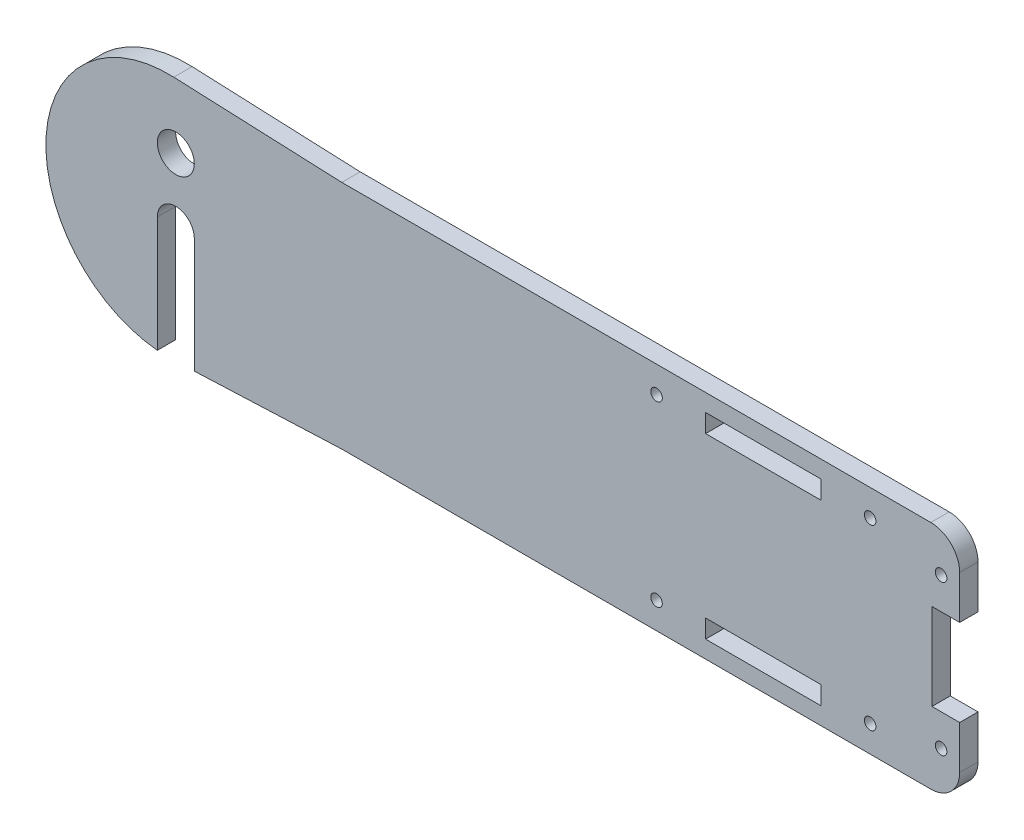
ISO-10303-21;
HEADER;
FILE_DESCRIPTION(('STEP AP214'),'2;1');
FILE_NAME('part.step','',(''),(''),'','','');
FILE_SCHEMA(('AUTOMOTIVE_DESIGN { 1 0 10303 214 1 1 1 1 }'));
ENDSEC;
DATA;
#1=APPLICATION_CONTEXT('core data for automotive mechanical design processes');
#2=APPLICATION_PROTOCOL_DEFINITION('international standard','automotive_design',2000,#1);
#3=PRODUCT_CONTEXT('',#1,'mechanical');
#4=PRODUCT('Part','Part','',(#3));
#5=PRODUCT_RELATED_PRODUCT_CATEGORY('part','',(#4));
#6=PRODUCT_DEFINITION_FORMATION('','',#4);
#7=PRODUCT_DEFINITION_CONTEXT('part definition',#1,'design');
#8=PRODUCT_DEFINITION('design','',#6,#7);
#9=PRODUCT_DEFINITION_SHAPE('','',#8);
#10=(LENGTH_UNIT() NAMED_UNIT(*) SI_UNIT(.MILLI.,.METRE.));
#11=(NAMED_UNIT(*) PLANE_ANGLE_UNIT() SI_UNIT($,.RADIAN.));
#12=(NAMED_UNIT(*) SI_UNIT($,.STERADIAN.) SOLID_ANGLE_UNIT());
#13=UNCERTAINTY_MEASURE_WITH_UNIT(LENGTH_MEASURE(1.E-05),#10,'distance_accuracy_value','');
#14=(GEOMETRIC_REPRESENTATION_CONTEXT(3) GLOBAL_UNCERTAINTY_ASSIGNED_CONTEXT((#13)) GLOBAL_UNIT_ASSIGNED_CONTEXT((#10,
#11,#12)) REPRESENTATION_CONTEXT('',''));
#15=CARTESIAN_POINT('',(0.,0.,0.));
#16=DIRECTION('',(0.,0.,1.));
#17=DIRECTION('',(1.,0.,0.));
#18=AXIS2_PLACEMENT_3D('',#15,#16,#17);
#19=CARTESIAN_POINT('',(-112.,0.,-3.175));
#20=DIRECTION('',(0.,0.,1.));
#21=DIRECTION('',(1.,0.,0.));
#22=AXIS2_PLACEMENT_3D('',#19,#20,#21);
#23=PLANE('',#22);
#24=CARTESIAN_POINT('',(-27.5,-15.4125,-3.175));
#25=DIRECTION('',(0.,0.,-1.));
#26=DIRECTION('',(1.,0.,0.));
#27=AXIS2_PLACEMENT_3D('',#24,#25,#26);
#28=CIRCLE('',#27,1.);
#29=CARTESIAN_POINT('',(-26.5,-15.4125,-3.175));
#30=VERTEX_POINT('',#29);
#31=EDGE_CURVE('E284',#30,#30,#28,.T.);
#32=ORIENTED_EDGE('',*,*,#31,.F.);
#33=EDGE_LOOP('',(#32));
#34=FACE_BOUND('',#33,.T.);
#35=CARTESIAN_POINT('',(9.5,-15.4125,-3.175));
#36=DIRECTION('',(0.,0.,-1.));
#37=DIRECTION('',(1.,0.,0.));
#38=AXIS2_PLACEMENT_3D('',#35,#36,#37);
#39=CIRCLE('',#38,1.);
#40=CARTESIAN_POINT('',(10.5,-15.4125,-3.175));
#41=VERTEX_POINT('',#40);
#42=EDGE_CURVE('E363',#41,#41,#39,.T.);
#43=ORIENTED_EDGE('',*,*,#42,.F.);
#44=EDGE_LOOP('',(#43));
#45=FACE_BOUND('',#44,.T.);
#46=DIRECTION('',(0.,1.,0.));
#47=VECTOR('',#46,1.);
#48=CARTESIAN_POINT('',(-19.,-17.,-3.175));
#49=LINE('',#48,#47);
#50=CARTESIAN_POINT('',(-19.,-17.,-3.175));
#51=VERTEX_POINT('',#50);
#52=CARTESIAN_POINT('',(-19.,-13.825,-3.175));
#53=VERTEX_POINT('',#52);
#54=EDGE_CURVE('E366',#51,#53,#49,.T.);
#55=ORIENTED_EDGE('',*,*,#54,.F.);
#56=DIRECTION('',(-1.,0.,0.));
#57=VECTOR('',#56,1.);
#58=CARTESIAN_POINT('',(-19.,-17.,-3.175));
#59=LINE('',#58,#57);
#60=CARTESIAN_POINT('',(1.,-17.,-3.175));
#61=VERTEX_POINT('',#60);
#62=EDGE_CURVE('E370',#61,#51,#59,.T.);
#63=ORIENTED_EDGE('',*,*,#62,.F.);
#64=DIRECTION('',(0.,-1.,0.));
#65=VECTOR('',#64,1.);
#66=CARTESIAN_POINT('',(1.,-17.,-3.175));
#67=LINE('',#66,#65);
#68=CARTESIAN_POINT('',(0.999999999999997,-13.825,-3.175));
#69=VERTEX_POINT('',#68);
#70=EDGE_CURVE('E372',#69,#61,#67,.T.);
#71=ORIENTED_EDGE('',*,*,#70,.F.);
#72=DIRECTION('',(1.,0.,0.));
#73=VECTOR('',#72,1.);
#74=CARTESIAN_POINT('',(-19.,-13.825,-3.175));
#75=LINE('',#74,#73);
#76=EDGE_CURVE('E375',#53,#69,#75,.T.);
#77=ORIENTED_EDGE('',*,*,#76,.F.);
#78=EDGE_LOOP('',(#55,#63,#71,#77));
#79=FACE_BOUND('',#78,.T.);
#80=CARTESIAN_POINT('',(-27.5,15.4125,-3.175));
#81=DIRECTION('',(0.,0.,1.));
#82=DIRECTION('',(1.,0.,0.));
#83=AXIS2_PLACEMENT_3D('',#80,#81,#82);
#84=CIRCLE('',#83,1.);
#85=CARTESIAN_POINT('',(-26.5,15.4125,-3.175));
#86=VERTEX_POINT('',#85);
#87=EDGE_CURVE('E274',#86,#86,#84,.T.);
#88=ORIENTED_EDGE('',*,*,#87,.T.);
#89=EDGE_LOOP('',(#88));
#90=FACE_BOUND('',#89,.T.);
#91=CARTESIAN_POINT('',(9.5,15.4125,-3.175));
#92=DIRECTION('',(0.,0.,1.));
#93=DIRECTION('',(1.,0.,0.));
#94=AXIS2_PLACEMENT_3D('',#91,#92,#93);
#95=CIRCLE('',#94,1.);
#96=CARTESIAN_POINT('',(10.5,15.4125,-3.175));
#97=VERTEX_POINT('',#96);
#98=EDGE_CURVE('E387',#97,#97,#95,.T.);
#99=ORIENTED_EDGE('',*,*,#98,.T.);
#100=EDGE_LOOP('',(#99));
#101=FACE_BOUND('',#100,.T.);
#102=DIRECTION('',(-1.,0.,0.));
#103=VECTOR('',#102,1.);
#104=CARTESIAN_POINT('',(-19.,17.,-3.175));
#105=LINE('',#104,#103);
#106=CARTESIAN_POINT('',(1.,17.,-3.175));
#107=VERTEX_POINT('',#106);
#108=CARTESIAN_POINT('',(-19.,17.,-3.175));
#109=VERTEX_POINT('',#108);
#110=EDGE_CURVE('E401',#107,#109,#105,.T.);
#111=ORIENTED_EDGE('',*,*,#110,.T.);
#112=DIRECTION('',(0.,-1.,0.));
#113=VECTOR('',#112,1.);
#114=CARTESIAN_POINT('',(-19.,17.,-3.175));
#115=LINE('',#114,#113);
#116=CARTESIAN_POINT('',(-19.,13.825,-3.175));
#117=VERTEX_POINT('',#116);
#118=EDGE_CURVE('E390',#109,#117,#115,.T.);
#119=ORIENTED_EDGE('',*,*,#118,.T.);
#120=DIRECTION('',(1.,0.,0.));
#121=VECTOR('',#120,1.);
#122=CARTESIAN_POINT('',(-19.,13.825,-3.175));
#123=LINE('',#122,#121);
#124=CARTESIAN_POINT('',(1.,13.825,-3.175));
#125=VERTEX_POINT('',#124);
#126=EDGE_CURVE('E395',#117,#125,#123,.T.);
#127=ORIENTED_EDGE('',*,*,#126,.T.);
#128=DIRECTION('',(0.,1.,0.));
#129=VECTOR('',#128,1.);
#130=CARTESIAN_POINT('',(1.,17.,-3.175));
#131=LINE('',#130,#129);
#132=EDGE_CURVE('E398',#125,#107,#131,.T.);
#133=ORIENTED_EDGE('',*,*,#132,.T.);
#134=EDGE_LOOP('',(#111,#119,#127,#133));
#135=FACE_BOUND('',#134,.T.);
#136=CARTESIAN_POINT('',(-110.75,9.99999999999999,-3.175));
#137=DIRECTION('',(0.,0.,1.));
#138=DIRECTION('',(1.,0.,0.));
#139=AXIS2_PLACEMENT_3D('',#136,#137,#138);
#140=CIRCLE('',#139,3.20000000000001);
#141=CARTESIAN_POINT('',(-107.55,9.99999999999999,-3.175));
#142=VERTEX_POINT('',#141);
#143=EDGE_CURVE('E238',#142,#142,#140,.T.);
#144=ORIENTED_EDGE('',*,*,#143,.T.);
#145=EDGE_LOOP('',(#144));
#146=FACE_BOUND('',#145,.T.);
#147=CARTESIAN_POINT('',(21.7875,13.,-3.175));
#148=DIRECTION('',(0.,0.,1.));
#149=DIRECTION('',(1.,0.,0.));
#150=AXIS2_PLACEMENT_3D('',#147,#148,#149);
#151=CIRCLE('',#150,1.);
#152=CARTESIAN_POINT('',(22.7875,13.,-3.175));
#153=VERTEX_POINT('',#152);
#154=EDGE_CURVE('E441',#153,#153,#151,.T.);
#155=ORIENTED_EDGE('',*,*,#154,.T.);
#156=EDGE_LOOP('',(#155));
#157=FACE_BOUND('',#156,.T.);
#158=CARTESIAN_POINT('',(21.7875,-13.,-3.175));
#159=DIRECTION('',(0.,0.,1.));
#160=DIRECTION('',(1.,0.,0.));
#161=AXIS2_PLACEMENT_3D('',#158,#159,#160);
#162=CIRCLE('',#161,1.);
#163=CARTESIAN_POINT('',(22.7875,-13.,-3.175));
#164=VERTEX_POINT('',#163);
#165=EDGE_CURVE('E444',#164,#164,#162,.T.);
#166=ORIENTED_EDGE('',*,*,#165,.T.);
#167=EDGE_LOOP('',(#166));
#168=FACE_BOUND('',#167,.T.);
#169=DIRECTION('',(0.,-1.,0.));
#170=VECTOR('',#169,1.);
#171=CARTESIAN_POINT('',(-107.55,0.,-3.175));
#172=LINE('',#171,#170);
#173=CARTESIAN_POINT('',(-107.55,-1.16034026191451,-3.17500000000001));
#174=VERTEX_POINT('',#173);
#175=CARTESIAN_POINT('',(-107.55,-21.0807673789859,-3.175));
#176=VERTEX_POINT('',#175);
#177=EDGE_CURVE('E49',#174,#176,#172,.T.);
#178=ORIENTED_EDGE('',*,*,#177,.F.);
#179=CARTESIAN_POINT('',(-110.75,-1.16034026191451,-3.17500000000001));
#180=DIRECTION('',(0.,0.,1.));
#181=DIRECTION('',(1.,0.,0.));
#182=AXIS2_PLACEMENT_3D('',#179,#180,#181);
#183=CIRCLE('',#182,3.2);
#184=CARTESIAN_POINT('',(-113.95,-1.16034026191451,-3.17500000000001));
#185=VERTEX_POINT('',#184);
#186=EDGE_CURVE('E446',#185,#174,#183,.F.);
#187=ORIENTED_EDGE('',*,*,#186,.F.);
#188=DIRECTION('',(0.,1.,0.));
#189=VECTOR('',#188,1.);
#190=CARTESIAN_POINT('',(-113.95,0.,-3.175));
#191=LINE('',#190,#189);
#192=CARTESIAN_POINT('',(-113.95,-21.1603402619145,-3.17500000000001));
#193=VERTEX_POINT('',#192);
#194=EDGE_CURVE('E318',#193,#185,#191,.T.);
#195=ORIENTED_EDGE('',*,*,#194,.F.);
#196=CARTESIAN_POINT('',(-112.,0.,-3.175));
#197=DIRECTION('',(0.,0.,1.));
#198=DIRECTION('',(1.,0.,0.));
#199=AXIS2_PLACEMENT_3D('',#196,#197,#198);
#200=CIRCLE('',#199,21.25);
#201=CARTESIAN_POINT('',(-111.101926123146,21.2310141847184,-3.175));
#202=VERTEX_POINT('',#201);
#203=EDGE_CURVE('E227',#202,#193,#200,.T.);
#204=ORIENTED_EDGE('',*,*,#203,.F.);
#205=DIRECTION('',(-0.999106549869099,0.0422623000872677,0.));
#206=VECTOR('',#205,1.);
#207=CARTESIAN_POINT('',(-111.101926123146,21.2310141847184,-3.175));
#208=LINE('',#207,#206);
#209=CARTESIAN_POINT('',(-82.,20.,-3.175));
#210=VERTEX_POINT('',#209);
#211=EDGE_CURVE('E235',#210,#202,#208,.T.);
#212=ORIENTED_EDGE('',*,*,#211,.F.);
#213=DIRECTION('',(-1.,0.,0.));
#214=VECTOR('',#213,1.);
#215=CARTESIAN_POINT('',(-82.,20.,-3.175));
#216=LINE('',#215,#214);
#217=CARTESIAN_POINT('',(20.,20.,-3.175));
#218=VERTEX_POINT('',#217);
#219=EDGE_CURVE('E331',#218,#210,#216,.T.);
#220=ORIENTED_EDGE('',*,*,#219,.F.);
#221=CARTESIAN_POINT('',(20.,15.,-3.175));
#222=DIRECTION('',(0.,0.,1.));
#223=DIRECTION('',(1.,0.,0.));
#224=AXIS2_PLACEMENT_3D('',#221,#222,#223);
#225=CIRCLE('',#224,5.);
#226=CARTESIAN_POINT('',(25.,15.,-3.175));
#227=VERTEX_POINT('',#226);
#228=EDGE_CURVE('E291',#218,#227,#225,.F.);
#229=ORIENTED_EDGE('',*,*,#228,.T.);
#230=DIRECTION('',(0.,1.,0.));
#231=VECTOR('',#230,1.);
#232=CARTESIAN_POINT('',(25.,20.,-3.175));
#233=LINE('',#232,#231);
#234=CARTESIAN_POINT('',(25.,7.5,-3.175));
#235=VERTEX_POINT('',#234);
#236=EDGE_CURVE('E328',#235,#227,#233,.T.);
#237=ORIENTED_EDGE('',*,*,#236,.F.);
#238=DIRECTION('',(-1.,0.,0.));
#239=VECTOR('',#238,1.);
#240=CARTESIAN_POINT('',(25.,7.5,-3.175));
#241=LINE('',#240,#239);
#242=CARTESIAN_POINT('',(20.2,7.5,-3.175));
#243=VERTEX_POINT('',#242);
#244=EDGE_CURVE('E448',#235,#243,#241,.T.);
#245=ORIENTED_EDGE('',*,*,#244,.T.);
#246=DIRECTION('',(0.,-1.,0.));
#247=VECTOR('',#246,1.);
#248=CARTESIAN_POINT('',(20.2,7.5,-3.175));
#249=LINE('',#248,#247);
#250=CARTESIAN_POINT('',(20.2,-7.5,-3.175));
#251=VERTEX_POINT('',#250);
#252=EDGE_CURVE('E454',#243,#251,#249,.T.);
#253=ORIENTED_EDGE('',*,*,#252,.T.);
#254=DIRECTION('',(1.,0.,0.));
#255=VECTOR('',#254,1.);
#256=CARTESIAN_POINT('',(25.,-7.5,-3.175));
#257=LINE('',#256,#255);
#258=CARTESIAN_POINT('',(25.,-7.5,-3.175));
#259=VERTEX_POINT('',#258);
#260=EDGE_CURVE('E457',#251,#259,#257,.T.);
#261=ORIENTED_EDGE('',*,*,#260,.T.);
#262=CARTESIAN_POINT('',(25.,-15.,-3.175));
#263=VERTEX_POINT('',#262);
#264=EDGE_CURVE('E329',#263,#259,#233,.T.);
#265=ORIENTED_EDGE('',*,*,#264,.F.);
#266=CARTESIAN_POINT('',(20.,-15.,-3.175));
#267=DIRECTION('',(0.,0.,1.));
#268=DIRECTION('',(1.,0.,0.));
#269=AXIS2_PLACEMENT_3D('',#266,#267,#268);
#270=CIRCLE('',#269,5.);
#271=CARTESIAN_POINT('',(20.,-20.,-3.175));
#272=VERTEX_POINT('',#271);
#273=EDGE_CURVE('E196',#263,#272,#270,.F.);
#274=ORIENTED_EDGE('',*,*,#273,.T.);
#275=DIRECTION('',(1.,0.,0.));
#276=VECTOR('',#275,1.);
#277=CARTESIAN_POINT('',(25.,-20.,-3.175));
#278=LINE('',#277,#276);
#279=CARTESIAN_POINT('',(-82.,-20.,-3.175));
#280=VERTEX_POINT('',#279);
#281=EDGE_CURVE('E321',#280,#272,#278,.T.);
#282=ORIENTED_EDGE('',*,*,#281,.F.);
#283=DIRECTION('',(0.999106549869099,0.0422623000872678,0.));
#284=VECTOR('',#283,1.);
#285=CARTESIAN_POINT('',(-82.,-20.,-3.175));
#286=LINE('',#285,#284);
#287=EDGE_CURVE('E319',#176,#280,#286,.T.);
#288=ORIENTED_EDGE('',*,*,#287,.F.);
#289=EDGE_LOOP('',(#178,#187,#195,#204,#212,#220,#229,#237,#245,#253,#261,#265,#274,#282,#288));
#290=FACE_BOUND('',#289,.T.);
#291=ADVANCED_FACE('F34',(#34,#45,#79,#90,#101,#135,#146,#157,#168,#290),#23,.F.);
#292=CARTESIAN_POINT('',(-112.,0.,0.));
#293=DIRECTION('',(0.,0.,1.));
#294=DIRECTION('',(1.,0.,0.));
#295=AXIS2_PLACEMENT_3D('',#292,#293,#294);
#296=PLANE('',#295);
#297=CARTESIAN_POINT('',(21.7875,-13.,0.));
#298=DIRECTION('',(0.,0.,1.));
#299=DIRECTION('',(1.,0.,0.));
#300=AXIS2_PLACEMENT_3D('',#297,#298,#299);
#301=CIRCLE('',#300,1.);
#302=CARTESIAN_POINT('',(22.7875,-13.,0.));
#303=VERTEX_POINT('',#302);
#304=EDGE_CURVE('E280',#303,#303,#301,.T.);
#305=ORIENTED_EDGE('',*,*,#304,.F.);
#306=EDGE_LOOP('',(#305));
#307=FACE_BOUND('',#306,.T.);
#308=CARTESIAN_POINT('',(21.7875,13.,0.));
#309=DIRECTION('',(0.,0.,1.));
#310=DIRECTION('',(1.,0.,0.));
#311=AXIS2_PLACEMENT_3D('',#308,#309,#310);
#312=CIRCLE('',#311,1.);
#313=CARTESIAN_POINT('',(22.7875,13.,0.));
#314=VERTEX_POINT('',#313);
#315=EDGE_CURVE('E277',#314,#314,#312,.T.);
#316=ORIENTED_EDGE('',*,*,#315,.F.);
#317=EDGE_LOOP('',(#316));
#318=FACE_BOUND('',#317,.T.);
#319=CARTESIAN_POINT('',(9.5,-15.4125,0.));
#320=DIRECTION('',(0.,0.,1.));
#321=DIRECTION('',(1.,0.,0.));
#322=AXIS2_PLACEMENT_3D('',#319,#320,#321);
#323=CIRCLE('',#322,1.);
#324=CARTESIAN_POINT('',(10.5,-15.4125,0.));
#325=VERTEX_POINT('',#324);
#326=EDGE_CURVE('E267',#325,#325,#323,.F.);
#327=ORIENTED_EDGE('',*,*,#326,.T.);
#328=EDGE_LOOP('',(#327));
#329=FACE_BOUND('',#328,.T.);
#330=CARTESIAN_POINT('',(-27.5,15.4125,0.));
#331=DIRECTION('',(0.,0.,1.));
#332=DIRECTION('',(1.,0.,0.));
#333=AXIS2_PLACEMENT_3D('',#330,#331,#332);
#334=CIRCLE('',#333,1.);
#335=CARTESIAN_POINT('',(-26.5,15.4125,0.));
#336=VERTEX_POINT('',#335);
#337=EDGE_CURVE('E251',#336,#336,#334,.T.);
#338=ORIENTED_EDGE('',*,*,#337,.F.);
#339=EDGE_LOOP('',(#338));
#340=FACE_BOUND('',#339,.T.);
#341=CARTESIAN_POINT('',(9.5,15.4125,0.));
#342=DIRECTION('',(0.,0.,1.));
#343=DIRECTION('',(1.,0.,0.));
#344=AXIS2_PLACEMENT_3D('',#341,#342,#343);
#345=CIRCLE('',#344,1.);
#346=CARTESIAN_POINT('',(10.5,15.4125,0.));
#347=VERTEX_POINT('',#346);
#348=EDGE_CURVE('E248',#347,#347,#345,.T.);
#349=ORIENTED_EDGE('',*,*,#348,.F.);
#350=EDGE_LOOP('',(#349));
#351=FACE_BOUND('',#350,.T.);
#352=DIRECTION('',(0.,-1.,0.));
#353=VECTOR('',#352,1.);
#354=CARTESIAN_POINT('',(-19.,1.01624745364311E-13,0.));
#355=LINE('',#354,#353);
#356=CARTESIAN_POINT('',(-19.,17.,0.));
#357=VERTEX_POINT('',#356);
#358=CARTESIAN_POINT('',(-19.,13.825,0.));
#359=VERTEX_POINT('',#358);
#360=EDGE_CURVE('E244',#357,#359,#355,.T.);
#361=ORIENTED_EDGE('',*,*,#360,.F.);
#362=DIRECTION('',(-1.,0.,0.));
#363=VECTOR('',#362,1.);
#364=CARTESIAN_POINT('',(-112.,17.,0.));
#365=LINE('',#364,#363);
#366=CARTESIAN_POINT('',(1.,17.,0.));
#367=VERTEX_POINT('',#366);
#368=EDGE_CURVE('E242',#367,#357,#365,.T.);
#369=ORIENTED_EDGE('',*,*,#368,.F.);
#370=DIRECTION('',(0.,1.,0.));
#371=VECTOR('',#370,1.);
#372=CARTESIAN_POINT('',(0.999999999999987,-1.23479529313625E-13,0.));
#373=LINE('',#372,#371);
#374=CARTESIAN_POINT('',(0.999999999999997,13.825,0.));
#375=VERTEX_POINT('',#374);
#376=EDGE_CURVE('E240',#375,#367,#373,.T.);
#377=ORIENTED_EDGE('',*,*,#376,.F.);
#378=DIRECTION('',(1.,0.,0.));
#379=VECTOR('',#378,1.);
#380=CARTESIAN_POINT('',(-112.,13.825,0.));
#381=LINE('',#380,#379);
#382=EDGE_CURVE('E230',#359,#375,#381,.T.);
#383=ORIENTED_EDGE('',*,*,#382,.F.);
#384=EDGE_LOOP('',(#361,#369,#377,#383));
#385=FACE_BOUND('',#384,.T.);
#386=CARTESIAN_POINT('',(-110.75,9.99999999999999,0.));
#387=DIRECTION('',(0.,0.,1.));
#388=DIRECTION('',(1.,0.,0.));
#389=AXIS2_PLACEMENT_3D('',#386,#387,#388);
#390=CIRCLE('',#389,3.20000000000001);
#391=CARTESIAN_POINT('',(-107.55,9.99999999999999,0.));
#392=VERTEX_POINT('',#391);
#393=EDGE_CURVE('E216',#392,#392,#390,.T.);
#394=ORIENTED_EDGE('',*,*,#393,.F.);
#395=EDGE_LOOP('',(#394));
#396=FACE_BOUND('',#395,.T.);
#397=DIRECTION('',(-1.,0.,0.));
#398=VECTOR('',#397,1.);
#399=CARTESIAN_POINT('',(-112.,-17.,0.));
#400=LINE('',#399,#398);
#401=CARTESIAN_POINT('',(1.,-17.,0.));
#402=VERTEX_POINT('',#401);
#403=CARTESIAN_POINT('',(-19.,-17.,0.));
#404=VERTEX_POINT('',#403);
#405=EDGE_CURVE('E247',#402,#404,#400,.T.);
#406=ORIENTED_EDGE('',*,*,#405,.T.);
#407=DIRECTION('',(0.,1.,0.));
#408=VECTOR('',#407,1.);
#409=CARTESIAN_POINT('',(-19.,-1.01624745364311E-13,0.));
#410=LINE('',#409,#408);
#411=CARTESIAN_POINT('',(-19.,-13.825,0.));
#412=VERTEX_POINT('',#411);
#413=EDGE_CURVE('E263',#404,#412,#410,.T.);
#414=ORIENTED_EDGE('',*,*,#413,.T.);
#415=DIRECTION('',(1.,0.,0.));
#416=VECTOR('',#415,1.);
#417=CARTESIAN_POINT('',(-112.,-13.825,0.));
#418=LINE('',#417,#416);
#419=CARTESIAN_POINT('',(0.999999999999997,-13.825,0.));
#420=VERTEX_POINT('',#419);
#421=EDGE_CURVE('E260',#412,#420,#418,.T.);
#422=ORIENTED_EDGE('',*,*,#421,.T.);
#423=DIRECTION('',(0.,-1.,0.));
#424=VECTOR('',#423,1.);
#425=CARTESIAN_POINT('',(0.999999999999987,1.23479529313625E-13,0.));
#426=LINE('',#425,#424);
#427=EDGE_CURVE('E257',#420,#402,#426,.T.);
#428=ORIENTED_EDGE('',*,*,#427,.T.);
#429=EDGE_LOOP('',(#406,#414,#422,#428));
#430=FACE_BOUND('',#429,.T.);
#431=CARTESIAN_POINT('',(-27.5,-15.4125,0.));
#432=DIRECTION('',(0.,0.,1.));
#433=DIRECTION('',(1.,0.,0.));
#434=AXIS2_PLACEMENT_3D('',#431,#432,#433);
#435=CIRCLE('',#434,1.);
#436=CARTESIAN_POINT('',(-26.5,-15.4125,0.));
#437=VERTEX_POINT('',#436);
#438=EDGE_CURVE('E270',#437,#437,#435,.F.);
#439=ORIENTED_EDGE('',*,*,#438,.T.);
#440=EDGE_LOOP('',(#439));
#441=FACE_BOUND('',#440,.T.);
#442=CARTESIAN_POINT('',(-110.75,-1.16034026191451,0.));
#443=DIRECTION('',(0.,0.,1.));
#444=DIRECTION('',(1.,0.,0.));
#445=AXIS2_PLACEMENT_3D('',#442,#443,#444);
#446=CIRCLE('',#445,3.2);
#447=CARTESIAN_POINT('',(-113.95,-1.16034026191451,0.));
#448=VERTEX_POINT('',#447);
#449=CARTESIAN_POINT('',(-107.55,-1.16034026191451,0.));
#450=VERTEX_POINT('',#449);
#451=EDGE_CURVE('E11',#448,#450,#446,.F.);
#452=ORIENTED_EDGE('',*,*,#451,.T.);
#453=DIRECTION('',(0.,-1.,0.));
#454=VECTOR('',#453,1.);
#455=CARTESIAN_POINT('',(-107.55,0.,0.));
#456=LINE('',#455,#454);
#457=CARTESIAN_POINT('',(-107.55,-21.0807673789859,0.));
#458=VERTEX_POINT('',#457);
#459=EDGE_CURVE('E191',#450,#458,#456,.T.);
#460=ORIENTED_EDGE('',*,*,#459,.T.);
#461=DIRECTION('',(0.999106549869099,0.0422623000872678,0.));
#462=VECTOR('',#461,1.);
#463=CARTESIAN_POINT('',(-82.,-20.,0.));
#464=LINE('',#463,#462);
#465=CARTESIAN_POINT('',(-82.,-20.,0.));
#466=VERTEX_POINT('',#465);
#467=EDGE_CURVE('E201',#458,#466,#464,.T.);
#468=ORIENTED_EDGE('',*,*,#467,.T.);
#469=DIRECTION('',(1.,0.,0.));
#470=VECTOR('',#469,1.);
#471=CARTESIAN_POINT('',(25.,-20.,0.));
#472=LINE('',#471,#470);
#473=CARTESIAN_POINT('',(20.,-20.,0.));
#474=VERTEX_POINT('',#473);
#475=EDGE_CURVE('E210',#466,#474,#472,.T.);
#476=ORIENTED_EDGE('',*,*,#475,.T.);
#477=CARTESIAN_POINT('',(20.,-15.,0.));
#478=DIRECTION('',(0.,0.,1.));
#479=DIRECTION('',(1.,0.,0.));
#480=AXIS2_PLACEMENT_3D('',#477,#478,#479);
#481=CIRCLE('',#480,5.);
#482=CARTESIAN_POINT('',(25.,-15.,0.));
#483=VERTEX_POINT('',#482);
#484=EDGE_CURVE('E296',#474,#483,#481,.T.);
#485=ORIENTED_EDGE('',*,*,#484,.T.);
#486=DIRECTION('',(0.,1.,0.));
#487=VECTOR('',#486,1.);
#488=CARTESIAN_POINT('',(25.,20.,0.));
#489=LINE('',#488,#487);
#490=CARTESIAN_POINT('',(25.,-7.5,0.));
#491=VERTEX_POINT('',#490);
#492=EDGE_CURVE('E220',#483,#491,#489,.T.);
#493=ORIENTED_EDGE('',*,*,#492,.T.);
#494=DIRECTION('',(1.,0.,0.));
#495=VECTOR('',#494,1.);
#496=CARTESIAN_POINT('',(-112.,-7.49999999999997,0.));
#497=LINE('',#496,#495);
#498=CARTESIAN_POINT('',(20.2,-7.5,0.));
#499=VERTEX_POINT('',#498);
#500=EDGE_CURVE('E281',#499,#491,#497,.T.);
#501=ORIENTED_EDGE('',*,*,#500,.F.);
#502=DIRECTION('',(0.,-1.,0.));
#503=VECTOR('',#502,1.);
#504=CARTESIAN_POINT('',(20.2,0.,0.));
#505=LINE('',#504,#503);
#506=CARTESIAN_POINT('',(20.2,7.5,0.));
#507=VERTEX_POINT('',#506);
#508=EDGE_CURVE('E266',#507,#499,#505,.T.);
#509=ORIENTED_EDGE('',*,*,#508,.F.);
#510=DIRECTION('',(-1.,0.,0.));
#511=VECTOR('',#510,1.);
#512=CARTESIAN_POINT('',(-112.,7.49999999999997,0.));
#513=LINE('',#512,#511);
#514=CARTESIAN_POINT('',(25.,7.5,0.));
#515=VERTEX_POINT('',#514);
#516=EDGE_CURVE('E348',#515,#507,#513,.T.);
#517=ORIENTED_EDGE('',*,*,#516,.F.);
#518=CARTESIAN_POINT('',(25.,15.,0.));
#519=VERTEX_POINT('',#518);
#520=EDGE_CURVE('E213',#515,#519,#489,.T.);
#521=ORIENTED_EDGE('',*,*,#520,.T.);
#522=CARTESIAN_POINT('',(20.,15.,0.));
#523=DIRECTION('',(0.,0.,1.));
#524=DIRECTION('',(1.,0.,0.));
#525=AXIS2_PLACEMENT_3D('',#522,#523,#524);
#526=CIRCLE('',#525,5.);
#527=CARTESIAN_POINT('',(20.,20.,0.));
#528=VERTEX_POINT('',#527);
#529=EDGE_CURVE('E287',#519,#528,#526,.T.);
#530=ORIENTED_EDGE('',*,*,#529,.T.);
#531=DIRECTION('',(-1.,0.,0.));
#532=VECTOR('',#531,1.);
#533=CARTESIAN_POINT('',(-82.,20.,0.));
#534=LINE('',#533,#532);
#535=CARTESIAN_POINT('',(-82.,20.,0.));
#536=VERTEX_POINT('',#535);
#537=EDGE_CURVE('E222',#528,#536,#534,.T.);
#538=ORIENTED_EDGE('',*,*,#537,.T.);
#539=DIRECTION('',(-0.999106549869099,0.0422623000872677,0.));
#540=VECTOR('',#539,1.);
#541=CARTESIAN_POINT('',(-111.101926123146,21.2310141847184,0.));
#542=LINE('',#541,#540);
#543=CARTESIAN_POINT('',(-111.101926123146,21.2310141847184,0.));
#544=VERTEX_POINT('',#543);
#545=EDGE_CURVE('E224',#536,#544,#542,.T.);
#546=ORIENTED_EDGE('',*,*,#545,.T.);
#547=CARTESIAN_POINT('',(-112.,0.,0.));
#548=DIRECTION('',(0.,0.,1.));
#549=DIRECTION('',(1.,0.,0.));
#550=AXIS2_PLACEMENT_3D('',#547,#548,#549);
#551=CIRCLE('',#550,21.25);
#552=CARTESIAN_POINT('',(-113.95,-21.1603402619145,0.));
#553=VERTEX_POINT('',#552);
#554=EDGE_CURVE('E211',#544,#553,#551,.T.);
#555=ORIENTED_EDGE('',*,*,#554,.T.);
#556=DIRECTION('',(0.,1.,0.));
#557=VECTOR('',#556,1.);
#558=CARTESIAN_POINT('',(-113.95,0.,0.));
#559=LINE('',#558,#557);
#560=EDGE_CURVE('E307',#553,#448,#559,.T.);
#561=ORIENTED_EDGE('',*,*,#560,.T.);
#562=EDGE_LOOP('',(#452,#460,#468,#476,#485,#493,#501,#509,#517,#521,#530,#538,#546,#555,#561));
#563=FACE_BOUND('',#562,.T.);
#564=ADVANCED_FACE('F199',(#307,#318,#329,#340,#351,#385,#396,#430,#441,#563),#296,.T.);
#565=CARTESIAN_POINT('',(-112.,0.,-3.175));
#566=DIRECTION('',(0.,0.,1.));
#567=DIRECTION('',(1.,0.,0.));
#568=AXIS2_PLACEMENT_3D('',#565,#566,#567);
#569=CYLINDRICAL_SURFACE('',#568,21.25);
#570=ORIENTED_EDGE('',*,*,#203,.T.);
#571=DIRECTION('',(0.,0.,1.));
#572=VECTOR('',#571,1.);
#573=CARTESIAN_POINT('',(-113.95,-21.1603402619145,-3.175));
#574=LINE('',#573,#572);
#575=EDGE_CURVE('E42',#193,#553,#574,.T.);
#576=ORIENTED_EDGE('',*,*,#575,.T.);
#577=ORIENTED_EDGE('',*,*,#554,.F.);
#578=DIRECTION('',(0.,0.,1.));
#579=VECTOR('',#578,1.);
#580=CARTESIAN_POINT('',(-111.101926123146,21.2310141847184,-3.175));
#581=LINE('',#580,#579);
#582=EDGE_CURVE('E228',#202,#544,#581,.T.);
#583=ORIENTED_EDGE('',*,*,#582,.F.);
#584=EDGE_LOOP('',(#570,#576,#577,#583));
#585=FACE_BOUND('',#584,.T.);
#586=ADVANCED_FACE('F303',(#585),#569,.T.);
#587=CARTESIAN_POINT('',(-82.,-20.,-3.175));
#588=DIRECTION('',(0.0422623000872678,-0.999106549869099,0.));
#589=DIRECTION('',(0.999106549869099,0.0422623000872678,0.));
#590=AXIS2_PLACEMENT_3D('',#587,#588,#589);
#591=PLANE('',#590);
#592=ORIENTED_EDGE('',*,*,#467,.F.);
#593=DIRECTION('',(0.,0.,-1.));
#594=VECTOR('',#593,1.);
#595=CARTESIAN_POINT('',(-107.55,-21.0807673789859,-3.175));
#596=LINE('',#595,#594);
#597=EDGE_CURVE('E188',#458,#176,#596,.T.);
#598=ORIENTED_EDGE('',*,*,#597,.T.);
#599=ORIENTED_EDGE('',*,*,#287,.T.);
#600=DIRECTION('',(0.,0.,1.));
#601=VECTOR('',#600,1.);
#602=CARTESIAN_POINT('',(-82.,-20.,-3.175));
#603=LINE('',#602,#601);
#604=EDGE_CURVE('E208',#280,#466,#603,.T.);
#605=ORIENTED_EDGE('',*,*,#604,.T.);
#606=EDGE_LOOP('',(#592,#598,#599,#605));
#607=FACE_BOUND('',#606,.T.);
#608=ADVANCED_FACE('F206',(#607),#591,.T.);
#609=CARTESIAN_POINT('',(25.,20.,-3.175));
#610=DIRECTION('',(1.,0.,0.));
#611=DIRECTION('',(0.,1.,0.));
#612=AXIS2_PLACEMENT_3D('',#609,#610,#611);
#613=PLANE('',#612);
#614=ORIENTED_EDGE('',*,*,#492,.F.);
#615=DIRECTION('',(0.,0.,1.));
#616=VECTOR('',#615,1.);
#617=CARTESIAN_POINT('',(25.,-15.,-3.175));
#618=LINE('',#617,#616);
#619=EDGE_CURVE('E57',#483,#263,#618,.F.);
#620=ORIENTED_EDGE('',*,*,#619,.T.);
#621=ORIENTED_EDGE('',*,*,#264,.T.);
#622=DIRECTION('',(0.,0.,1.));
#623=VECTOR('',#622,1.);
#624=CARTESIAN_POINT('',(25.,-7.5,-3.175));
#625=LINE('',#624,#623);
#626=EDGE_CURVE('E352',#259,#491,#625,.T.);
#627=ORIENTED_EDGE('',*,*,#626,.T.);
#628=EDGE_LOOP('',(#614,#620,#621,#627));
#629=FACE_BOUND('',#628,.T.);
#630=ADVANCED_FACE('F470',(#629),#613,.T.);
#631=CARTESIAN_POINT('',(-111.101926123146,21.2310141847184,-3.175));
#632=DIRECTION('',(0.0422623000872677,0.999106549869099,0.));
#633=DIRECTION('',(-0.999106549869099,0.0422623000872677,0.));
#634=AXIS2_PLACEMENT_3D('',#631,#632,#633);
#635=PLANE('',#634);
#636=ORIENTED_EDGE('',*,*,#545,.F.);
#637=DIRECTION('',(0.,0.,1.));
#638=VECTOR('',#637,1.);
#639=CARTESIAN_POINT('',(-82.,20.,-3.175));
#640=LINE('',#639,#638);
#641=EDGE_CURVE('E231',#210,#536,#640,.T.);
#642=ORIENTED_EDGE('',*,*,#641,.F.);
#643=ORIENTED_EDGE('',*,*,#211,.T.);
#644=ORIENTED_EDGE('',*,*,#582,.T.);
#645=EDGE_LOOP('',(#636,#642,#643,#644));
#646=FACE_BOUND('',#645,.T.);
#647=ADVANCED_FACE('F312',(#646),#635,.T.);
#648=CARTESIAN_POINT('',(-82.,20.,-3.175));
#649=DIRECTION('',(0.,1.,0.));
#650=DIRECTION('',(0.,0.,1.));
#651=AXIS2_PLACEMENT_3D('',#648,#649,#650);
#652=PLANE('',#651);
#653=ORIENTED_EDGE('',*,*,#537,.F.);
#654=DIRECTION('',(0.,0.,1.));
#655=VECTOR('',#654,1.);
#656=CARTESIAN_POINT('',(20.,20.,-3.175));
#657=LINE('',#656,#655);
#658=EDGE_CURVE('E289',#528,#218,#657,.F.);
#659=ORIENTED_EDGE('',*,*,#658,.T.);
#660=ORIENTED_EDGE('',*,*,#219,.T.);
#661=ORIENTED_EDGE('',*,*,#641,.T.);
#662=EDGE_LOOP('',(#653,#659,#660,#661));
#663=FACE_BOUND('',#662,.T.);
#664=ADVANCED_FACE('F333',(#663),#652,.T.);
#665=ORIENTED_EDGE('',*,*,#236,.T.);
#666=DIRECTION('',(0.,0.,1.));
#667=VECTOR('',#666,1.);
#668=CARTESIAN_POINT('',(25.,15.,-3.175));
#669=LINE('',#668,#667);
#670=EDGE_CURVE('E276',#227,#519,#669,.T.);
#671=ORIENTED_EDGE('',*,*,#670,.T.);
#672=ORIENTED_EDGE('',*,*,#520,.F.);
#673=DIRECTION('',(0.,0.,1.));
#674=VECTOR('',#673,1.);
#675=CARTESIAN_POINT('',(25.,7.5,-3.175));
#676=LINE('',#675,#674);
#677=EDGE_CURVE('E360',#235,#515,#676,.T.);
#678=ORIENTED_EDGE('',*,*,#677,.F.);
#679=EDGE_LOOP('',(#665,#671,#672,#678));
#680=FACE_BOUND('',#679,.T.);
#681=ADVANCED_FACE('F344',(#680),#613,.T.);
#682=CARTESIAN_POINT('',(25.,-20.,-3.175));
#683=DIRECTION('',(0.,-1.,0.));
#684=DIRECTION('',(1.,0.,0.));
#685=AXIS2_PLACEMENT_3D('',#682,#683,#684);
#686=PLANE('',#685);
#687=ORIENTED_EDGE('',*,*,#281,.T.);
#688=DIRECTION('',(0.,0.,1.));
#689=VECTOR('',#688,1.);
#690=CARTESIAN_POINT('',(20.,-20.,-3.175));
#691=LINE('',#690,#689);
#692=EDGE_CURVE('E293',#272,#474,#691,.T.);
#693=ORIENTED_EDGE('',*,*,#692,.T.);
#694=ORIENTED_EDGE('',*,*,#475,.F.);
#695=ORIENTED_EDGE('',*,*,#604,.F.);
#696=EDGE_LOOP('',(#687,#693,#694,#695));
#697=FACE_BOUND('',#696,.T.);
#698=ADVANCED_FACE('F476',(#697),#686,.T.);
#699=CARTESIAN_POINT('',(-110.75,9.99999999999999,-3.175));
#700=DIRECTION('',(0.,0.,1.));
#701=DIRECTION('',(1.,0.,0.));
#702=AXIS2_PLACEMENT_3D('',#699,#700,#701);
#703=CYLINDRICAL_SURFACE('',#702,3.20000000000001);
#704=ORIENTED_EDGE('',*,*,#393,.T.);
#705=EDGE_LOOP('',(#704));
#706=FACE_BOUND('',#705,.T.);
#707=ORIENTED_EDGE('',*,*,#143,.F.);
#708=EDGE_LOOP('',(#707));
#709=FACE_BOUND('',#708,.T.);
#710=ADVANCED_FACE('F552',(#706,#709),#703,.F.);
#711=CARTESIAN_POINT('',(-19.,17.,-3.175));
#712=DIRECTION('',(-1.,0.,0.));
#713=DIRECTION('',(0.,-1.,0.));
#714=AXIS2_PLACEMENT_3D('',#711,#712,#713);
#715=PLANE('',#714);
#716=ORIENTED_EDGE('',*,*,#360,.T.);
#717=DIRECTION('',(0.,0.,1.));
#718=VECTOR('',#717,1.);
#719=CARTESIAN_POINT('',(-19.,13.825,-3.175));
#720=LINE('',#719,#718);
#721=EDGE_CURVE('E404',#117,#359,#720,.T.);
#722=ORIENTED_EDGE('',*,*,#721,.F.);
#723=ORIENTED_EDGE('',*,*,#118,.F.);
#724=DIRECTION('',(0.,0.,1.));
#725=VECTOR('',#724,1.);
#726=CARTESIAN_POINT('',(-19.,17.,-3.175));
#727=LINE('',#726,#725);
#728=EDGE_CURVE('E252',#109,#357,#727,.T.);
#729=ORIENTED_EDGE('',*,*,#728,.T.);
#730=EDGE_LOOP('',(#716,#722,#723,#729));
#731=FACE_BOUND('',#730,.T.);
#732=ADVANCED_FACE('F420',(#731),#715,.F.);
#733=CARTESIAN_POINT('',(-19.,17.,-3.175));
#734=DIRECTION('',(0.,1.,0.));
#735=DIRECTION('',(-1.,0.,0.));
#736=AXIS2_PLACEMENT_3D('',#733,#734,#735);
#737=PLANE('',#736);
#738=ORIENTED_EDGE('',*,*,#368,.T.);
#739=ORIENTED_EDGE('',*,*,#728,.F.);
#740=ORIENTED_EDGE('',*,*,#110,.F.);
#741=DIRECTION('',(0.,0.,1.));
#742=VECTOR('',#741,1.);
#743=CARTESIAN_POINT('',(1.,17.,-3.175));
#744=LINE('',#743,#742);
#745=EDGE_CURVE('E407',#107,#367,#744,.T.);
#746=ORIENTED_EDGE('',*,*,#745,.T.);
#747=EDGE_LOOP('',(#738,#739,#740,#746));
#748=FACE_BOUND('',#747,.T.);
#749=ADVANCED_FACE('F429',(#748),#737,.F.);
#750=CARTESIAN_POINT('',(1.,17.,-3.175));
#751=DIRECTION('',(1.,0.,0.));
#752=DIRECTION('',(0.,1.,0.));
#753=AXIS2_PLACEMENT_3D('',#750,#751,#752);
#754=PLANE('',#753);
#755=ORIENTED_EDGE('',*,*,#376,.T.);
#756=ORIENTED_EDGE('',*,*,#745,.F.);
#757=ORIENTED_EDGE('',*,*,#132,.F.);
#758=DIRECTION('',(0.,0.,1.));
#759=VECTOR('',#758,1.);
#760=CARTESIAN_POINT('',(0.999999999999997,13.825,-3.175));
#761=LINE('',#760,#759);
#762=EDGE_CURVE('E410',#125,#375,#761,.T.);
#763=ORIENTED_EDGE('',*,*,#762,.T.);
#764=EDGE_LOOP('',(#755,#756,#757,#763));
#765=FACE_BOUND('',#764,.T.);
#766=ADVANCED_FACE('F426',(#765),#754,.F.);
#767=CARTESIAN_POINT('',(-19.,13.825,-3.175));
#768=DIRECTION('',(0.,-1.,0.));
#769=DIRECTION('',(1.,0.,0.));
#770=AXIS2_PLACEMENT_3D('',#767,#768,#769);
#771=PLANE('',#770);
#772=ORIENTED_EDGE('',*,*,#382,.T.);
#773=ORIENTED_EDGE('',*,*,#762,.F.);
#774=ORIENTED_EDGE('',*,*,#126,.F.);
#775=ORIENTED_EDGE('',*,*,#721,.T.);
#776=EDGE_LOOP('',(#772,#773,#774,#775));
#777=FACE_BOUND('',#776,.T.);
#778=ADVANCED_FACE('F414',(#777),#771,.F.);
#779=CARTESIAN_POINT('',(9.5,15.4125,-3.175));
#780=DIRECTION('',(0.,0.,1.));
#781=DIRECTION('',(1.,0.,0.));
#782=AXIS2_PLACEMENT_3D('',#779,#780,#781);
#783=CYLINDRICAL_SURFACE('',#782,1.);
#784=ORIENTED_EDGE('',*,*,#348,.T.);
#785=EDGE_LOOP('',(#784));
#786=FACE_BOUND('',#785,.T.);
#787=ORIENTED_EDGE('',*,*,#98,.F.);
#788=EDGE_LOOP('',(#787));
#789=FACE_BOUND('',#788,.T.);
#790=ADVANCED_FACE('F537',(#786,#789),#783,.F.);
#791=CARTESIAN_POINT('',(-27.5,15.4125,-3.175));
#792=DIRECTION('',(0.,0.,1.));
#793=DIRECTION('',(1.,0.,0.));
#794=AXIS2_PLACEMENT_3D('',#791,#792,#793);
#795=CYLINDRICAL_SURFACE('',#794,1.);
#796=ORIENTED_EDGE('',*,*,#337,.T.);
#797=EDGE_LOOP('',(#796));
#798=FACE_BOUND('',#797,.T.);
#799=ORIENTED_EDGE('',*,*,#87,.F.);
#800=EDGE_LOOP('',(#799));
#801=FACE_BOUND('',#800,.T.);
#802=ADVANCED_FACE('F535',(#798,#801),#795,.F.);
#803=CARTESIAN_POINT('',(-19.,-17.,-3.175));
#804=DIRECTION('',(1.,0.,0.));
#805=DIRECTION('',(0.,1.,0.));
#806=AXIS2_PLACEMENT_3D('',#803,#804,#805);
#807=PLANE('',#806);
#808=DIRECTION('',(0.,0.,1.));
#809=VECTOR('',#808,1.);
#810=CARTESIAN_POINT('',(-19.,-17.,-3.175));
#811=LINE('',#810,#809);
#812=EDGE_CURVE('E377',#51,#404,#811,.T.);
#813=ORIENTED_EDGE('',*,*,#812,.F.);
#814=ORIENTED_EDGE('',*,*,#54,.T.);
#815=DIRECTION('',(0.,0.,1.));
#816=VECTOR('',#815,1.);
#817=CARTESIAN_POINT('',(-19.,-13.825,-3.175));
#818=LINE('',#817,#816);
#819=EDGE_CURVE('E271',#53,#412,#818,.T.);
#820=ORIENTED_EDGE('',*,*,#819,.T.);
#821=ORIENTED_EDGE('',*,*,#413,.F.);
#822=EDGE_LOOP('',(#813,#814,#820,#821));
#823=FACE_BOUND('',#822,.T.);
#824=ADVANCED_FACE('F525',(#823),#807,.T.);
#825=CARTESIAN_POINT('',(-19.,-13.825,-3.175));
#826=DIRECTION('',(0.,-1.,0.));
#827=DIRECTION('',(1.,0.,0.));
#828=AXIS2_PLACEMENT_3D('',#825,#826,#827);
#829=PLANE('',#828);
#830=ORIENTED_EDGE('',*,*,#819,.F.);
#831=ORIENTED_EDGE('',*,*,#76,.T.);
#832=DIRECTION('',(0.,0.,1.));
#833=VECTOR('',#832,1.);
#834=CARTESIAN_POINT('',(0.999999999999997,-13.825,-3.175));
#835=LINE('',#834,#833);
#836=EDGE_CURVE('E380',#69,#420,#835,.T.);
#837=ORIENTED_EDGE('',*,*,#836,.T.);
#838=ORIENTED_EDGE('',*,*,#421,.F.);
#839=EDGE_LOOP('',(#830,#831,#837,#838));
#840=FACE_BOUND('',#839,.T.);
#841=ADVANCED_FACE('F521',(#840),#829,.T.);
#842=CARTESIAN_POINT('',(1.,-17.,-3.175));
#843=DIRECTION('',(-1.,0.,0.));
#844=DIRECTION('',(0.,-1.,0.));
#845=AXIS2_PLACEMENT_3D('',#842,#843,#844);
#846=PLANE('',#845);
#847=ORIENTED_EDGE('',*,*,#836,.F.);
#848=ORIENTED_EDGE('',*,*,#70,.T.);
#849=DIRECTION('',(0.,0.,1.));
#850=VECTOR('',#849,1.);
#851=CARTESIAN_POINT('',(1.,-17.,-3.175));
#852=LINE('',#851,#850);
#853=EDGE_CURVE('E383',#61,#402,#852,.T.);
#854=ORIENTED_EDGE('',*,*,#853,.T.);
#855=ORIENTED_EDGE('',*,*,#427,.F.);
#856=EDGE_LOOP('',(#847,#848,#854,#855));
#857=FACE_BOUND('',#856,.T.);
#858=ADVANCED_FACE('F524',(#857),#846,.T.);
#859=CARTESIAN_POINT('',(-19.,-17.,-3.175));
#860=DIRECTION('',(0.,1.,0.));
#861=DIRECTION('',(-1.,0.,0.));
#862=AXIS2_PLACEMENT_3D('',#859,#860,#861);
#863=PLANE('',#862);
#864=ORIENTED_EDGE('',*,*,#853,.F.);
#865=ORIENTED_EDGE('',*,*,#62,.T.);
#866=ORIENTED_EDGE('',*,*,#812,.T.);
#867=ORIENTED_EDGE('',*,*,#405,.F.);
#868=EDGE_LOOP('',(#864,#865,#866,#867));
#869=FACE_BOUND('',#868,.T.);
#870=ADVANCED_FACE('F516',(#869),#863,.T.);
#871=CARTESIAN_POINT('',(9.5,-15.4125,-3.175));
#872=DIRECTION('',(0.,0.,1.));
#873=DIRECTION('',(1.,0.,0.));
#874=AXIS2_PLACEMENT_3D('',#871,#872,#873);
#875=CYLINDRICAL_SURFACE('',#874,1.);
#876=ORIENTED_EDGE('',*,*,#326,.F.);
#877=EDGE_LOOP('',(#876));
#878=FACE_BOUND('',#877,.T.);
#879=ORIENTED_EDGE('',*,*,#42,.T.);
#880=EDGE_LOOP('',(#879));
#881=FACE_BOUND('',#880,.T.);
#882=ADVANCED_FACE('F513',(#878,#881),#875,.F.);
#883=CARTESIAN_POINT('',(-27.5,-15.4125,-3.175));
#884=DIRECTION('',(0.,0.,1.));
#885=DIRECTION('',(1.,0.,0.));
#886=AXIS2_PLACEMENT_3D('',#883,#884,#885);
#887=CYLINDRICAL_SURFACE('',#886,1.);
#888=ORIENTED_EDGE('',*,*,#438,.F.);
#889=EDGE_LOOP('',(#888));
#890=FACE_BOUND('',#889,.T.);
#891=ORIENTED_EDGE('',*,*,#31,.T.);
#892=EDGE_LOOP('',(#891));
#893=FACE_BOUND('',#892,.T.);
#894=ADVANCED_FACE('F508',(#890,#893),#887,.F.);
#895=CARTESIAN_POINT('',(25.,-7.5,-3.175));
#896=DIRECTION('',(0.,-1.,0.));
#897=DIRECTION('',(1.,0.,0.));
#898=AXIS2_PLACEMENT_3D('',#895,#896,#897);
#899=PLANE('',#898);
#900=ORIENTED_EDGE('',*,*,#500,.T.);
#901=ORIENTED_EDGE('',*,*,#626,.F.);
#902=ORIENTED_EDGE('',*,*,#260,.F.);
#903=DIRECTION('',(0.,0.,1.));
#904=VECTOR('',#903,1.);
#905=CARTESIAN_POINT('',(20.2,-7.5,-3.175));
#906=LINE('',#905,#904);
#907=EDGE_CURVE('E357',#251,#499,#906,.T.);
#908=ORIENTED_EDGE('',*,*,#907,.T.);
#909=EDGE_LOOP('',(#900,#901,#902,#908));
#910=FACE_BOUND('',#909,.T.);
#911=ADVANCED_FACE('F469',(#910),#899,.F.);
#912=CARTESIAN_POINT('',(20.2,7.5,-3.175));
#913=DIRECTION('',(-1.,0.,0.));
#914=DIRECTION('',(0.,0.,1.));
#915=AXIS2_PLACEMENT_3D('',#912,#913,#914);
#916=PLANE('',#915);
#917=ORIENTED_EDGE('',*,*,#508,.T.);
#918=ORIENTED_EDGE('',*,*,#907,.F.);
#919=ORIENTED_EDGE('',*,*,#252,.F.);
#920=DIRECTION('',(0.,0.,1.));
#921=VECTOR('',#920,1.);
#922=CARTESIAN_POINT('',(20.2,7.5,-3.175));
#923=LINE('',#922,#921);
#924=EDGE_CURVE('E461',#243,#507,#923,.T.);
#925=ORIENTED_EDGE('',*,*,#924,.T.);
#926=EDGE_LOOP('',(#917,#918,#919,#925));
#927=FACE_BOUND('',#926,.T.);
#928=ADVANCED_FACE('F466',(#927),#916,.F.);
#929=CARTESIAN_POINT('',(25.,7.5,-3.175));
#930=DIRECTION('',(0.,1.,0.));
#931=DIRECTION('',(-1.,0.,0.));
#932=AXIS2_PLACEMENT_3D('',#929,#930,#931);
#933=PLANE('',#932);
#934=ORIENTED_EDGE('',*,*,#516,.T.);
#935=ORIENTED_EDGE('',*,*,#924,.F.);
#936=ORIENTED_EDGE('',*,*,#244,.F.);
#937=ORIENTED_EDGE('',*,*,#677,.T.);
#938=EDGE_LOOP('',(#934,#935,#936,#937));
#939=FACE_BOUND('',#938,.T.);
#940=ADVANCED_FACE('F464',(#939),#933,.F.);
#941=CARTESIAN_POINT('',(21.7875,13.,-3.175));
#942=DIRECTION('',(0.,0.,1.));
#943=DIRECTION('',(1.,0.,0.));
#944=AXIS2_PLACEMENT_3D('',#941,#942,#943);
#945=CYLINDRICAL_SURFACE('',#944,1.);
#946=ORIENTED_EDGE('',*,*,#315,.T.);
#947=EDGE_LOOP('',(#946));
#948=FACE_BOUND('',#947,.T.);
#949=ORIENTED_EDGE('',*,*,#154,.F.);
#950=EDGE_LOOP('',(#949));
#951=FACE_BOUND('',#950,.T.);
#952=ADVANCED_FACE('F498',(#948,#951),#945,.F.);
#953=CARTESIAN_POINT('',(21.7875,-13.,-3.175));
#954=DIRECTION('',(0.,0.,1.));
#955=DIRECTION('',(1.,0.,0.));
#956=AXIS2_PLACEMENT_3D('',#953,#954,#955);
#957=CYLINDRICAL_SURFACE('',#956,1.);
#958=ORIENTED_EDGE('',*,*,#304,.T.);
#959=EDGE_LOOP('',(#958));
#960=FACE_BOUND('',#959,.T.);
#961=ORIENTED_EDGE('',*,*,#165,.F.);
#962=EDGE_LOOP('',(#961));
#963=FACE_BOUND('',#962,.T.);
#964=ADVANCED_FACE('F501',(#960,#963),#957,.F.);
#965=CARTESIAN_POINT('',(20.,15.,-3.175));
#966=DIRECTION('',(0.,0.,1.));
#967=DIRECTION('',(1.,0.,0.));
#968=AXIS2_PLACEMENT_3D('',#965,#966,#967);
#969=CYLINDRICAL_SURFACE('',#968,5.);
#970=ORIENTED_EDGE('',*,*,#228,.F.);
#971=ORIENTED_EDGE('',*,*,#658,.F.);
#972=ORIENTED_EDGE('',*,*,#529,.F.);
#973=ORIENTED_EDGE('',*,*,#670,.F.);
#974=EDGE_LOOP('',(#970,#971,#972,#973));
#975=FACE_BOUND('',#974,.T.);
#976=ADVANCED_FACE('F340',(#975),#969,.T.);
#977=CARTESIAN_POINT('',(20.,-15.,-3.175));
#978=DIRECTION('',(0.,0.,1.));
#979=DIRECTION('',(1.,0.,0.));
#980=AXIS2_PLACEMENT_3D('',#977,#978,#979);
#981=CYLINDRICAL_SURFACE('',#980,5.);
#982=ORIENTED_EDGE('',*,*,#273,.F.);
#983=ORIENTED_EDGE('',*,*,#619,.F.);
#984=ORIENTED_EDGE('',*,*,#484,.F.);
#985=ORIENTED_EDGE('',*,*,#692,.F.);
#986=EDGE_LOOP('',(#982,#983,#984,#985));
#987=FACE_BOUND('',#986,.T.);
#988=ADVANCED_FACE('F36',(#987),#981,.T.);
#989=CARTESIAN_POINT('',(-110.75,-1.16034026191451,204.860444590488));
#990=DIRECTION('',(0.,0.,-1.));
#991=DIRECTION('',(-1.,0.,0.));
#992=AXIS2_PLACEMENT_3D('',#989,#990,#991);
#993=CYLINDRICAL_SURFACE('',#992,3.2);
#994=DIRECTION('',(0.,0.,-1.));
#995=VECTOR('',#994,1.);
#996=CARTESIAN_POINT('',(-113.95,-1.16034026191451,204.860444590488));
#997=LINE('',#996,#995);
#998=EDGE_CURVE('E484',#448,#185,#997,.T.);
#999=ORIENTED_EDGE('',*,*,#998,.T.);
#1000=ORIENTED_EDGE('',*,*,#186,.T.);
#1001=DIRECTION('',(0.,0.,-1.));
#1002=VECTOR('',#1001,1.);
#1003=CARTESIAN_POINT('',(-107.55,-1.16034026191451,204.860444590488));
#1004=LINE('',#1003,#1002);
#1005=EDGE_CURVE('E204',#450,#174,#1004,.T.);
#1006=ORIENTED_EDGE('',*,*,#1005,.F.);
#1007=ORIENTED_EDGE('',*,*,#451,.F.);
#1008=EDGE_LOOP('',(#999,#1000,#1006,#1007));
#1009=FACE_BOUND('',#1008,.T.);
#1010=ADVANCED_FACE('F486',(#1009),#993,.F.);
#1011=CARTESIAN_POINT('',(-113.95,-1.16034026191451,204.860444590488));
#1012=DIRECTION('',(1.,0.,0.));
#1013=DIRECTION('',(0.,0.,-1.));
#1014=AXIS2_PLACEMENT_3D('',#1011,#1012,#1013);
#1015=PLANE('',#1014);
#1016=ORIENTED_EDGE('',*,*,#575,.F.);
#1017=ORIENTED_EDGE('',*,*,#194,.T.);
#1018=ORIENTED_EDGE('',*,*,#998,.F.);
#1019=ORIENTED_EDGE('',*,*,#560,.F.);
#1020=EDGE_LOOP('',(#1016,#1017,#1018,#1019));
#1021=FACE_BOUND('',#1020,.T.);
#1022=ADVANCED_FACE('F483',(#1021),#1015,.T.);
#1023=CARTESIAN_POINT('',(-107.55,-1.16034026191451,204.860444590488));
#1024=DIRECTION('',(-1.,0.,0.));
#1025=DIRECTION('',(0.,0.,1.));
#1026=AXIS2_PLACEMENT_3D('',#1023,#1024,#1025);
#1027=PLANE('',#1026);
#1028=ORIENTED_EDGE('',*,*,#1005,.T.);
#1029=ORIENTED_EDGE('',*,*,#177,.T.);
#1030=ORIENTED_EDGE('',*,*,#597,.F.);
#1031=ORIENTED_EDGE('',*,*,#459,.F.);
#1032=EDGE_LOOP('',(#1028,#1029,#1030,#1031));
#1033=FACE_BOUND('',#1032,.T.);
#1034=ADVANCED_FACE('F190',(#1033),#1027,.T.);
#1035=CLOSED_SHELL('',(#291,#564,#586,#608,#630,#647,#664,#681,#698,#710,#732,#749,#766,#778,
#790,#802,#824,#841,#858,#870,#882,#894,#911,#928,#940,#952,#964,#976,#988,#1010,#1022,#1034));
#1036=MANIFOLD_SOLID_BREP('B2',#1035);
#1037=ADVANCED_BREP_SHAPE_REPRESENTATION('',(#18,#1036),#14);
#1038=SHAPE_DEFINITION_REPRESENTATION(#9,#1037);
ENDSEC;
END-ISO-10303-21;
